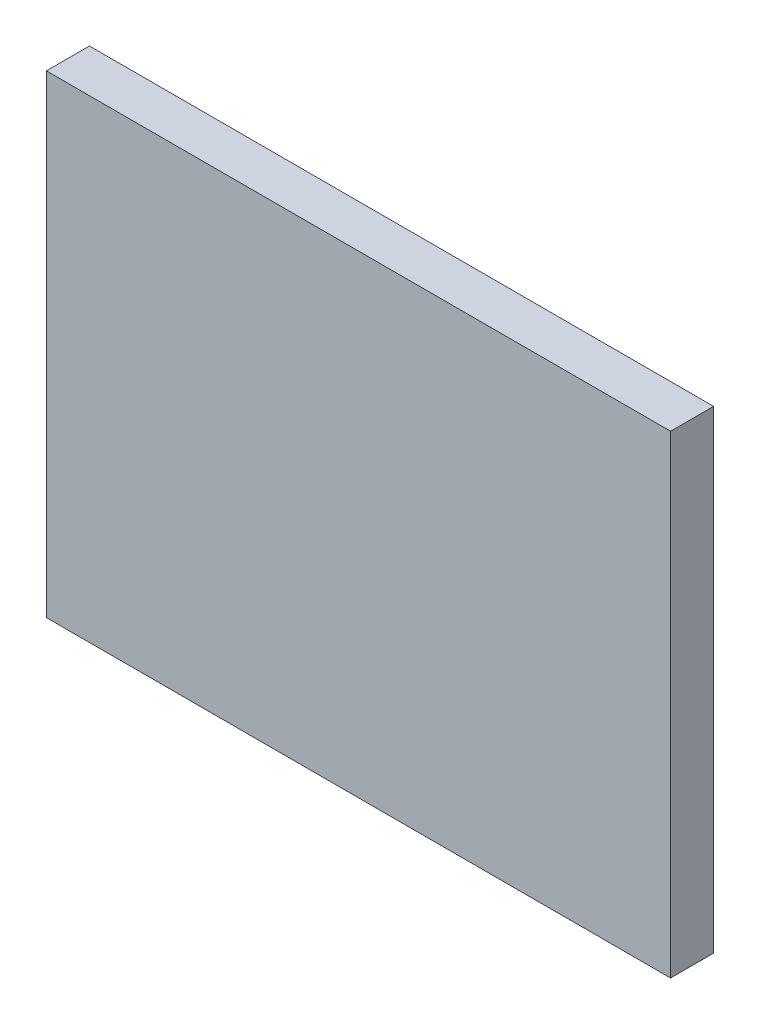
ISO-10303-21;
HEADER;
FILE_DESCRIPTION(('STEP AP214'),'2;1');
FILE_NAME('part.step','',(''),(''),'','','');
FILE_SCHEMA(('AUTOMOTIVE_DESIGN { 1 0 10303 214 1 1 1 1 }'));
ENDSEC;
DATA;
#1=APPLICATION_CONTEXT('core data for automotive mechanical design processes');
#2=APPLICATION_PROTOCOL_DEFINITION('international standard','automotive_design',2000,#1);
#3=PRODUCT_CONTEXT('',#1,'mechanical');
#4=PRODUCT('Part','Part','',(#3));
#5=PRODUCT_RELATED_PRODUCT_CATEGORY('part','',(#4));
#6=PRODUCT_DEFINITION_FORMATION('','',#4);
#7=PRODUCT_DEFINITION_CONTEXT('part definition',#1,'design');
#8=PRODUCT_DEFINITION('design','',#6,#7);
#9=PRODUCT_DEFINITION_SHAPE('','',#8);
#10=(LENGTH_UNIT() NAMED_UNIT(*) SI_UNIT(.MILLI.,.METRE.));
#11=(NAMED_UNIT(*) PLANE_ANGLE_UNIT() SI_UNIT($,.RADIAN.));
#12=(NAMED_UNIT(*) SI_UNIT($,.STERADIAN.) SOLID_ANGLE_UNIT());
#13=UNCERTAINTY_MEASURE_WITH_UNIT(LENGTH_MEASURE(1.E-05),#10,'distance_accuracy_value','');
#14=(GEOMETRIC_REPRESENTATION_CONTEXT(3) GLOBAL_UNCERTAINTY_ASSIGNED_CONTEXT((#13)) GLOBAL_UNIT_ASSIGNED_CONTEXT((#10,
#11,#12)) REPRESENTATION_CONTEXT('',''));
#15=CARTESIAN_POINT('',(0.,0.,0.));
#16=DIRECTION('',(0.,0.,1.));
#17=DIRECTION('',(1.,0.,0.));
#18=AXIS2_PLACEMENT_3D('',#15,#16,#17);
#19=CARTESIAN_POINT('',(-72.5,55.,10.));
#20=DIRECTION('',(1.,0.,0.));
#21=DIRECTION('',(0.,0.,-1.));
#22=AXIS2_PLACEMENT_3D('',#19,#20,#21);
#23=PLANE('',#22);
#24=DIRECTION('',(0.,-1.,0.));
#25=VECTOR('',#24,1.);
#26=CARTESIAN_POINT('',(-72.5,55.,0.));
#27=LINE('',#26,#25);
#28=CARTESIAN_POINT('',(-72.5,55.,0.));
#29=VERTEX_POINT('',#28);
#30=CARTESIAN_POINT('',(-72.5,-55.,0.));
#31=VERTEX_POINT('',#30);
#32=EDGE_CURVE('E104',#29,#31,#27,.T.);
#33=ORIENTED_EDGE('',*,*,#32,.T.);
#34=DIRECTION('',(0.,0.,-1.));
#35=VECTOR('',#34,1.);
#36=CARTESIAN_POINT('',(-72.5,-55.,10.));
#37=LINE('',#36,#35);
#38=CARTESIAN_POINT('',(-72.5,-55.,10.));
#39=VERTEX_POINT('',#38);
#40=EDGE_CURVE('E11',#39,#31,#37,.T.);
#41=ORIENTED_EDGE('',*,*,#40,.F.);
#42=DIRECTION('',(0.,-1.,0.));
#43=VECTOR('',#42,1.);
#44=CARTESIAN_POINT('',(-72.5,55.,10.));
#45=LINE('',#44,#43);
#46=CARTESIAN_POINT('',(-72.5,55.,10.));
#47=VERTEX_POINT('',#46);
#48=EDGE_CURVE('E90',#47,#39,#45,.T.);
#49=ORIENTED_EDGE('',*,*,#48,.F.);
#50=DIRECTION('',(0.,0.,-1.));
#51=VECTOR('',#50,1.);
#52=CARTESIAN_POINT('',(-72.5,55.,10.));
#53=LINE('',#52,#51);
#54=EDGE_CURVE('E57',#47,#29,#53,.T.);
#55=ORIENTED_EDGE('',*,*,#54,.T.);
#56=EDGE_LOOP('',(#33,#41,#49,#55));
#57=FACE_BOUND('',#56,.T.);
#58=ADVANCED_FACE('F41',(#57),#23,.F.);
#59=CARTESIAN_POINT('',(-72.5,-55.,10.));
#60=DIRECTION('',(0.,1.,0.));
#61=DIRECTION('',(0.,0.,1.));
#62=AXIS2_PLACEMENT_3D('',#59,#60,#61);
#63=PLANE('',#62);
#64=DIRECTION('',(1.,0.,0.));
#65=VECTOR('',#64,1.);
#66=CARTESIAN_POINT('',(-72.5,-55.,0.));
#67=LINE('',#66,#65);
#68=CARTESIAN_POINT('',(72.5,-55.,0.));
#69=VERTEX_POINT('',#68);
#70=EDGE_CURVE('E95',#31,#69,#67,.T.);
#71=ORIENTED_EDGE('',*,*,#70,.T.);
#72=DIRECTION('',(0.,0.,-1.));
#73=VECTOR('',#72,1.);
#74=CARTESIAN_POINT('',(72.5,-55.,10.));
#75=LINE('',#74,#73);
#76=CARTESIAN_POINT('',(72.5,-55.,10.));
#77=VERTEX_POINT('',#76);
#78=EDGE_CURVE('E49',#77,#69,#75,.T.);
#79=ORIENTED_EDGE('',*,*,#78,.F.);
#80=DIRECTION('',(1.,0.,0.));
#81=VECTOR('',#80,1.);
#82=CARTESIAN_POINT('',(-72.5,-55.,10.));
#83=LINE('',#82,#81);
#84=EDGE_CURVE('E82',#39,#77,#83,.T.);
#85=ORIENTED_EDGE('',*,*,#84,.F.);
#86=ORIENTED_EDGE('',*,*,#40,.T.);
#87=EDGE_LOOP('',(#71,#79,#85,#86));
#88=FACE_BOUND('',#87,.T.);
#89=ADVANCED_FACE('F94',(#88),#63,.F.);
#90=CARTESIAN_POINT('',(72.5,55.,10.));
#91=DIRECTION('',(1.,0.,0.));
#92=DIRECTION('',(0.,0.,-1.));
#93=AXIS2_PLACEMENT_3D('',#90,#91,#92);
#94=PLANE('',#93);
#95=DIRECTION('',(0.,-1.,0.));
#96=VECTOR('',#95,1.);
#97=CARTESIAN_POINT('',(72.5,55.,0.));
#98=LINE('',#97,#96);
#99=CARTESIAN_POINT('',(72.5,55.,0.));
#100=VERTEX_POINT('',#99);
#101=EDGE_CURVE('E107',#100,#69,#98,.T.);
#102=ORIENTED_EDGE('',*,*,#101,.F.);
#103=DIRECTION('',(0.,0.,-1.));
#104=VECTOR('',#103,1.);
#105=CARTESIAN_POINT('',(72.5,55.,10.));
#106=LINE('',#105,#104);
#107=CARTESIAN_POINT('',(72.5,55.,10.));
#108=VERTEX_POINT('',#107);
#109=EDGE_CURVE('E71',#108,#100,#106,.T.);
#110=ORIENTED_EDGE('',*,*,#109,.F.);
#111=DIRECTION('',(0.,-1.,0.));
#112=VECTOR('',#111,1.);
#113=CARTESIAN_POINT('',(72.5,55.,10.));
#114=LINE('',#113,#112);
#115=EDGE_CURVE('E89',#108,#77,#114,.T.);
#116=ORIENTED_EDGE('',*,*,#115,.T.);
#117=ORIENTED_EDGE('',*,*,#78,.T.);
#118=EDGE_LOOP('',(#102,#110,#116,#117));
#119=FACE_BOUND('',#118,.T.);
#120=ADVANCED_FACE('F98',(#119),#94,.T.);
#121=CARTESIAN_POINT('',(-72.5,55.,10.));
#122=DIRECTION('',(0.,1.,0.));
#123=DIRECTION('',(0.,0.,1.));
#124=AXIS2_PLACEMENT_3D('',#121,#122,#123);
#125=PLANE('',#124);
#126=DIRECTION('',(1.,0.,0.));
#127=VECTOR('',#126,1.);
#128=CARTESIAN_POINT('',(-72.5,55.,0.));
#129=LINE('',#128,#127);
#130=EDGE_CURVE('E109',#29,#100,#129,.T.);
#131=ORIENTED_EDGE('',*,*,#130,.F.);
#132=ORIENTED_EDGE('',*,*,#54,.F.);
#133=DIRECTION('',(1.,0.,0.));
#134=VECTOR('',#133,1.);
#135=CARTESIAN_POINT('',(-72.5,55.,10.));
#136=LINE('',#135,#134);
#137=EDGE_CURVE('E99',#47,#108,#136,.T.);
#138=ORIENTED_EDGE('',*,*,#137,.T.);
#139=ORIENTED_EDGE('',*,*,#109,.T.);
#140=EDGE_LOOP('',(#131,#132,#138,#139));
#141=FACE_BOUND('',#140,.T.);
#142=ADVANCED_FACE('F115',(#141),#125,.T.);
#143=CARTESIAN_POINT('',(0.,0.,10.));
#144=DIRECTION('',(0.,0.,1.));
#145=DIRECTION('',(1.,0.,0.));
#146=AXIS2_PLACEMENT_3D('',#143,#144,#145);
#147=PLANE('',#146);
#148=ORIENTED_EDGE('',*,*,#48,.T.);
#149=ORIENTED_EDGE('',*,*,#84,.T.);
#150=ORIENTED_EDGE('',*,*,#115,.F.);
#151=ORIENTED_EDGE('',*,*,#137,.F.);
#152=EDGE_LOOP('',(#148,#149,#150,#151));
#153=FACE_BOUND('',#152,.T.);
#154=ADVANCED_FACE('F86',(#153),#147,.T.);
#155=CARTESIAN_POINT('',(0.,0.,0.));
#156=DIRECTION('',(0.,0.,1.));
#157=DIRECTION('',(1.,0.,0.));
#158=AXIS2_PLACEMENT_3D('',#155,#156,#157);
#159=PLANE('',#158);
#160=ORIENTED_EDGE('',*,*,#32,.F.);
#161=ORIENTED_EDGE('',*,*,#130,.T.);
#162=ORIENTED_EDGE('',*,*,#101,.T.);
#163=ORIENTED_EDGE('',*,*,#70,.F.);
#164=EDGE_LOOP('',(#160,#161,#162,#163));
#165=FACE_BOUND('',#164,.T.);
#166=ADVANCED_FACE('F114',(#165),#159,.F.);
#167=CLOSED_SHELL('',(#58,#89,#120,#142,#154,#166));
#168=MANIFOLD_SOLID_BREP('B2',#167);
#169=ADVANCED_BREP_SHAPE_REPRESENTATION('',(#18,#168),#14);
#170=SHAPE_DEFINITION_REPRESENTATION(#9,#169);
ENDSEC;
END-ISO-10303-21;
